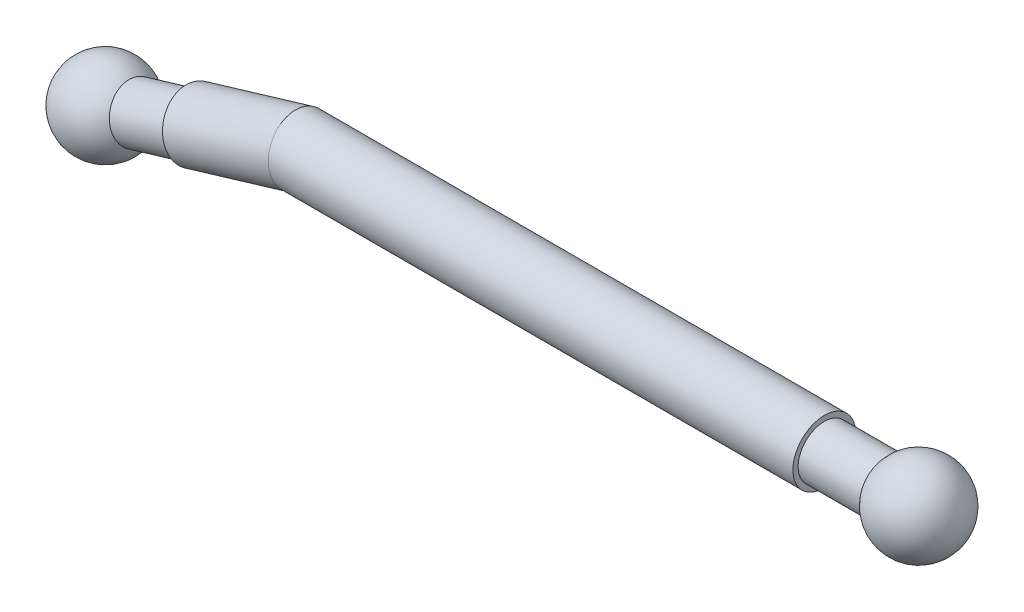
ISO-10303-21;
HEADER;
FILE_DESCRIPTION(('STEP AP214'),'2;1');
FILE_NAME('part.step','',(''),(''),'','','');
FILE_SCHEMA(('AUTOMOTIVE_DESIGN { 1 0 10303 214 1 1 1 1 }'));
ENDSEC;
DATA;
#1=APPLICATION_CONTEXT('core data for automotive mechanical design processes');
#2=APPLICATION_PROTOCOL_DEFINITION('international standard','automotive_design',2000,#1);
#3=PRODUCT_CONTEXT('',#1,'mechanical');
#4=PRODUCT('Part','Part','',(#3));
#5=PRODUCT_RELATED_PRODUCT_CATEGORY('part','',(#4));
#6=PRODUCT_DEFINITION_FORMATION('','',#4);
#7=PRODUCT_DEFINITION_CONTEXT('part definition',#1,'design');
#8=PRODUCT_DEFINITION('design','',#6,#7);
#9=PRODUCT_DEFINITION_SHAPE('','',#8);
#10=(LENGTH_UNIT() NAMED_UNIT(*) SI_UNIT(.MILLI.,.METRE.));
#11=(NAMED_UNIT(*) PLANE_ANGLE_UNIT() SI_UNIT($,.RADIAN.));
#12=(NAMED_UNIT(*) SI_UNIT($,.STERADIAN.) SOLID_ANGLE_UNIT());
#13=UNCERTAINTY_MEASURE_WITH_UNIT(LENGTH_MEASURE(1.E-05),#10,'distance_accuracy_value','');
#14=(GEOMETRIC_REPRESENTATION_CONTEXT(3) GLOBAL_UNCERTAINTY_ASSIGNED_CONTEXT((#13)) GLOBAL_UNIT_ASSIGNED_CONTEXT((#10,
#11,#12)) REPRESENTATION_CONTEXT('',''));
#15=CARTESIAN_POINT('',(0.,0.,0.));
#16=DIRECTION('',(0.,0.,1.));
#17=DIRECTION('',(1.,0.,0.));
#18=AXIS2_PLACEMENT_3D('',#15,#16,#17);
#19=CARTESIAN_POINT('',(6.,0.,0.));
#20=DIRECTION('',(-1.,0.,0.));
#21=DIRECTION('',(0.,0.,1.));
#22=AXIS2_PLACEMENT_3D('',#19,#20,#21);
#23=CYLINDRICAL_SURFACE('',#22,2.5);
#24=CARTESIAN_POINT('',(0.,0.,0.));
#25=DIRECTION('',(1.,0.,0.));
#26=DIRECTION('',(0.,0.,-1.));
#27=AXIS2_PLACEMENT_3D('',#24,#25,#26);
#28=CIRCLE('',#27,2.5);
#29=CARTESIAN_POINT('',(0.,0.,-2.5));
#30=VERTEX_POINT('',#29);
#31=EDGE_CURVE('E41',#30,#30,#28,.T.);
#32=ORIENTED_EDGE('',*,*,#31,.T.);
#33=EDGE_LOOP('',(#32));
#34=FACE_BOUND('',#33,.T.);
#35=CARTESIAN_POINT('',(5.8775010008008,0.,0.));
#36=DIRECTION('',(1.,0.,0.));
#37=DIRECTION('',(0.,0.,-1.));
#38=AXIS2_PLACEMENT_3D('',#35,#36,#37);
#39=CIRCLE('',#38,2.5);
#40=CARTESIAN_POINT('',(5.8775010008008,0.,-2.5));
#41=VERTEX_POINT('',#40);
#42=EDGE_CURVE('E11',#41,#41,#39,.T.);
#43=ORIENTED_EDGE('',*,*,#42,.F.);
#44=EDGE_LOOP('',(#43));
#45=FACE_BOUND('',#44,.T.);
#46=ADVANCED_FACE('F33',(#34,#45),#23,.T.);
#47=CARTESIAN_POINT('',(-65.7083900276338,-4.85264625904171,0.));
#48=DIRECTION('',(0.957826285221151,0.287347885566345,0.));
#49=DIRECTION('',(-0.287347885566345,0.957826285221152,0.));
#50=AXIS2_PLACEMENT_3D('',#47,#48,#49);
#51=CYLINDRICAL_SURFACE('',#50,2.5);
#52=CARTESIAN_POINT('',(-59.9614323163069,-3.12855894564364,0.));
#53=DIRECTION('',(-0.957826285221152,-0.287347885566345,0.));
#54=DIRECTION('',(0.287347885566345,-0.957826285221152,0.));
#55=AXIS2_PLACEMENT_3D('',#52,#53,#54);
#56=CIRCLE('',#55,2.5);
#57=CARTESIAN_POINT('',(-59.2430626023911,-5.52312465869652,0.));
#58=VERTEX_POINT('',#57);
#59=EDGE_CURVE('E59',#58,#58,#56,.T.);
#60=ORIENTED_EDGE('',*,*,#59,.T.);
#61=EDGE_LOOP('',(#60));
#62=FACE_BOUND('',#61,.T.);
#63=CARTESIAN_POINT('',(-65.5910572662876,-4.81744643063784,0.));
#64=DIRECTION('',(-0.957826285221151,-0.287347885566345,0.));
#65=DIRECTION('',(0.287347885566345,-0.957826285221152,0.));
#66=AXIS2_PLACEMENT_3D('',#63,#64,#65);
#67=CIRCLE('',#66,2.5);
#68=CARTESIAN_POINT('',(-64.8726875523717,-7.21201214369072,0.));
#69=VERTEX_POINT('',#68);
#70=EDGE_CURVE('E62',#69,#69,#67,.T.);
#71=ORIENTED_EDGE('',*,*,#70,.F.);
#72=EDGE_LOOP('',(#71));
#73=FACE_BOUND('',#72,.T.);
#74=ADVANCED_FACE('F84',(#62,#73),#51,.T.);
#75=CARTESIAN_POINT('',(-60.,-3.,0.));
#76=DIRECTION('',(0.957826285221151,0.287347885566345,0.));
#77=DIRECTION('',(0.,0.,-1.));
#78=AXIS2_PLACEMENT_3D('',#75,#76,#77);
#79=PLANE('',#78);
#80=ORIENTED_EDGE('',*,*,#59,.F.);
#81=EDGE_LOOP('',(#80));
#82=FACE_BOUND('',#81,.T.);
#83=CARTESIAN_POINT('',(-60.,-3.,0.));
#84=DIRECTION('',(0.957826285221151,0.287347885566345,0.));
#85=DIRECTION('',(0.,0.,-1.));
#86=AXIS2_PLACEMENT_3D('',#83,#84,#85);
#87=CIRCLE('',#86,3.);
#88=CARTESIAN_POINT('',(-60.,-3.,-3.));
#89=VERTEX_POINT('',#88);
#90=EDGE_CURVE('E46',#89,#89,#87,.T.);
#91=ORIENTED_EDGE('',*,*,#90,.F.);
#92=EDGE_LOOP('',(#91));
#93=FACE_BOUND('',#92,.T.);
#94=ADVANCED_FACE('F35',(#82,#93),#79,.F.);
#95=CARTESIAN_POINT('',(0.,0.,0.));
#96=DIRECTION('',(1.,0.,0.));
#97=DIRECTION('',(0.,0.,-1.));
#98=AXIS2_PLACEMENT_3D('',#95,#96,#97);
#99=PLANE('',#98);
#100=ORIENTED_EDGE('',*,*,#31,.F.);
#101=EDGE_LOOP('',(#100));
#102=FACE_BOUND('',#101,.T.);
#103=CARTESIAN_POINT('',(0.,0.,0.));
#104=DIRECTION('',(1.,0.,0.));
#105=DIRECTION('',(0.,0.,-1.));
#106=AXIS2_PLACEMENT_3D('',#103,#104,#105);
#107=CIRCLE('',#106,3.);
#108=CARTESIAN_POINT('',(0.,0.,-3.));
#109=VERTEX_POINT('',#108);
#110=EDGE_CURVE('E51',#109,#109,#107,.T.);
#111=ORIENTED_EDGE('',*,*,#110,.T.);
#112=EDGE_LOOP('',(#111));
#113=FACE_BOUND('',#112,.T.);
#114=ADVANCED_FACE('F75',(#102,#113),#99,.T.);
#115=CARTESIAN_POINT('',(-48.9763956463432,0.307081306097034,0.));
#116=DIRECTION('',(-0.957826285221151,-0.287347885566345,0.));
#117=DIRECTION('',(0.287347885566345,-0.957826285221151,0.));
#118=AXIS2_PLACEMENT_3D('',#115,#116,#117);
#119=CYLINDRICAL_SURFACE('',#118,3.);
#120=CARTESIAN_POINT('',(-50.,0.,0.));
#121=DIRECTION('',(-0.989400395497483,-0.145213144685405,0.));
#122=DIRECTION('',(-0.145213144685405,0.989400395497483,0.));
#123=AXIS2_PLACEMENT_3D('',#120,#121,#122);
#124=ELLIPSE('',#123,3.0321394792768,3.);
#125=CARTESIAN_POINT('',(-50.4403065089106,3.,0.));
#126=VERTEX_POINT('',#125);
#127=EDGE_CURVE('E56',#126,#126,#124,.T.);
#128=ORIENTED_EDGE('',*,*,#127,.T.);
#129=EDGE_LOOP('',(#128));
#130=FACE_BOUND('',#129,.T.);
#131=ORIENTED_EDGE('',*,*,#90,.T.);
#132=EDGE_LOOP('',(#131));
#133=FACE_BOUND('',#132,.T.);
#134=ADVANCED_FACE('F78',(#130,#133),#119,.T.);
#135=CARTESIAN_POINT('',(0.,0.,0.));
#136=DIRECTION('',(-1.,0.,0.));
#137=DIRECTION('',(0.,-1.,0.));
#138=AXIS2_PLACEMENT_3D('',#135,#136,#137);
#139=CYLINDRICAL_SURFACE('',#138,3.);
#140=ORIENTED_EDGE('',*,*,#110,.F.);
#141=EDGE_LOOP('',(#140));
#142=FACE_BOUND('',#141,.T.);
#143=ORIENTED_EDGE('',*,*,#127,.F.);
#144=EDGE_LOOP('',(#143));
#145=FACE_BOUND('',#144,.T.);
#146=ADVANCED_FACE('F57',(#142,#145),#139,.T.);
#147=CARTESIAN_POINT('',(-68.5818688832973,-5.71468991574075,0.));
#148=DIRECTION('',(-0.287347885566346,0.957826285221151,0.));
#149=DIRECTION('',(0.,0.,-1.));
#150=AXIS2_PLACEMENT_3D('',#147,#148,#149);
#151=SPHERICAL_SURFACE('',#150,4.);
#152=CARTESIAN_POINT('',(-68.5818688832973,-5.71468991574075,0.));
#153=DIRECTION('',(-0.957826285221152,-0.287347885566345,0.));
#154=DIRECTION('',(0.287347885566345,-0.957826285221151,0.));
#155=AXIS2_PLACEMENT_3D('',#152,#153,#154);
#156=SPHERICAL_SURFACE('',#155,4.);
#157=ORIENTED_EDGE('',*,*,#70,.T.);
#158=EDGE_LOOP('',(#157));
#159=FACE_BOUND('',#158,.T.);
#160=ADVANCED_FACE('F86',(#159),#156,.T.);
#161=CARTESIAN_POINT('',(9.,0.,0.));
#162=DIRECTION('',(0.,1.,0.));
#163=DIRECTION('',(0.,0.,1.));
#164=AXIS2_PLACEMENT_3D('',#161,#162,#163);
#165=SPHERICAL_SURFACE('',#164,4.);
#166=CARTESIAN_POINT('',(9.,0.,0.));
#167=DIRECTION('',(1.,0.,0.));
#168=DIRECTION('',(0.,0.,-1.));
#169=AXIS2_PLACEMENT_3D('',#166,#167,#168);
#170=SPHERICAL_SURFACE('',#169,4.);
#171=ORIENTED_EDGE('',*,*,#42,.T.);
#172=EDGE_LOOP('',(#171));
#173=FACE_BOUND('',#172,.T.);
#174=ADVANCED_FACE('F96',(#173),#170,.T.);
#175=CLOSED_SHELL('',(#46,#74,#94,#114,#134,#146,#160,#174));
#176=MANIFOLD_SOLID_BREP('B2',#175);
#177=ADVANCED_BREP_SHAPE_REPRESENTATION('',(#18,#176),#14);
#178=SHAPE_DEFINITION_REPRESENTATION(#9,#177);
ENDSEC;
END-ISO-10303-21;
